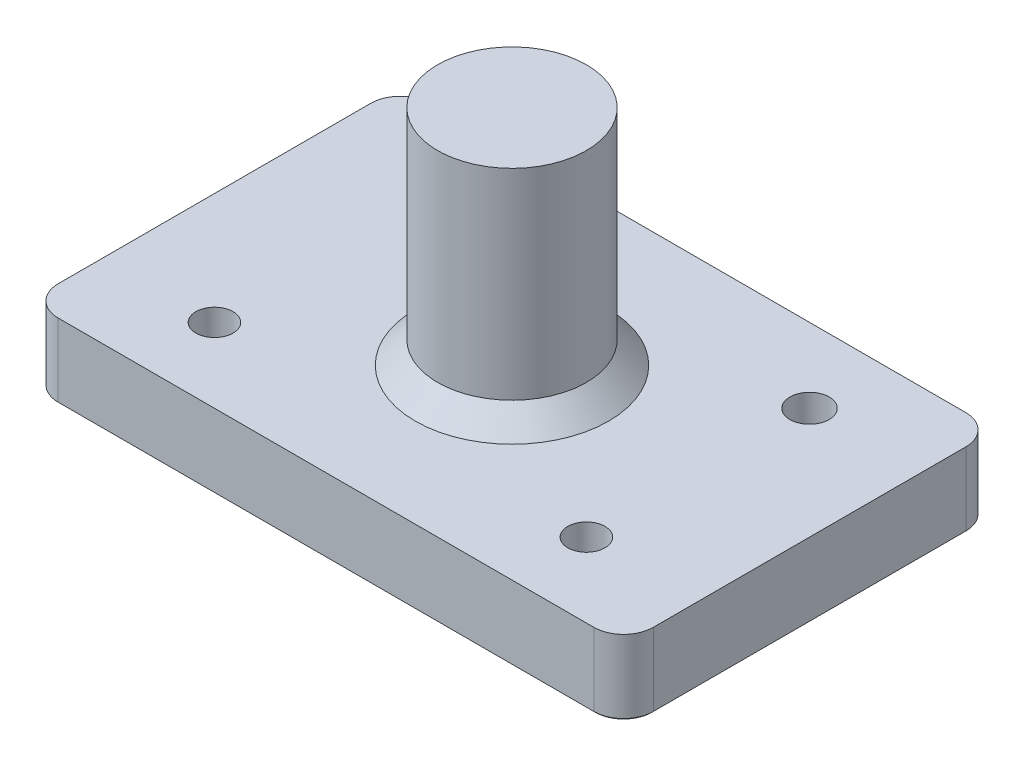
ISO-10303-21;
HEADER;
FILE_DESCRIPTION(('STEP AP214'),'2;1');
FILE_NAME('part.step','',(''),(''),'','','');
FILE_SCHEMA(('AUTOMOTIVE_DESIGN { 1 0 10303 214 1 1 1 1 }'));
ENDSEC;
DATA;
#1=APPLICATION_CONTEXT('core data for automotive mechanical design processes');
#2=APPLICATION_PROTOCOL_DEFINITION('international standard','automotive_design',2000,#1);
#3=PRODUCT_CONTEXT('',#1,'mechanical');
#4=PRODUCT('Part','Part','',(#3));
#5=PRODUCT_RELATED_PRODUCT_CATEGORY('part','',(#4));
#6=PRODUCT_DEFINITION_FORMATION('','',#4);
#7=PRODUCT_DEFINITION_CONTEXT('part definition',#1,'design');
#8=PRODUCT_DEFINITION('design','',#6,#7);
#9=PRODUCT_DEFINITION_SHAPE('','',#8);
#10=(LENGTH_UNIT() NAMED_UNIT(*) SI_UNIT(.MILLI.,.METRE.));
#11=(NAMED_UNIT(*) PLANE_ANGLE_UNIT() SI_UNIT($,.RADIAN.));
#12=(NAMED_UNIT(*) SI_UNIT($,.STERADIAN.) SOLID_ANGLE_UNIT());
#13=UNCERTAINTY_MEASURE_WITH_UNIT(LENGTH_MEASURE(1.E-05),#10,'distance_accuracy_value','');
#14=(GEOMETRIC_REPRESENTATION_CONTEXT(3) GLOBAL_UNCERTAINTY_ASSIGNED_CONTEXT((#13)) GLOBAL_UNIT_ASSIGNED_CONTEXT((#10,
#11,#12)) REPRESENTATION_CONTEXT('',''));
#15=CARTESIAN_POINT('',(0.,0.,0.));
#16=DIRECTION('',(0.,0.,1.));
#17=DIRECTION('',(1.,0.,0.));
#18=AXIS2_PLACEMENT_3D('',#15,#16,#17);
#19=CARTESIAN_POINT('',(0.,12.7,0.));
#20=DIRECTION('',(0.,-1.,0.));
#21=DIRECTION('',(0.,0.,-1.));
#22=AXIS2_PLACEMENT_3D('',#19,#20,#21);
#23=PLANE('',#22);
#24=CARTESIAN_POINT('',(0.,12.7,0.));
#25=DIRECTION('',(0.,-1.,0.));
#26=DIRECTION('',(0.,0.,-1.));
#27=AXIS2_PLACEMENT_3D('',#24,#25,#26);
#28=CIRCLE('',#27,16.5100000000001);
#29=CARTESIAN_POINT('',(0.,12.7,-16.5100000000001));
#30=VERTEX_POINT('',#29);
#31=EDGE_CURVE('E150',#30,#30,#28,.T.);
#32=ORIENTED_EDGE('',*,*,#31,.T.);
#33=EDGE_LOOP('',(#32));
#34=FACE_BOUND('',#33,.T.);
#35=DIRECTION('',(0.,0.,1.));
#36=VECTOR('',#35,1.);
#37=CARTESIAN_POINT('',(-50.8000000000001,12.7,31.75));
#38=LINE('',#37,#36);
#39=CARTESIAN_POINT('',(-50.8000000000001,12.7,-26.6700000000001));
#40=VERTEX_POINT('',#39);
#41=CARTESIAN_POINT('',(-50.8000000000001,12.7,26.67));
#42=VERTEX_POINT('',#41);
#43=EDGE_CURVE('E133',#40,#42,#38,.T.);
#44=ORIENTED_EDGE('',*,*,#43,.T.);
#45=CARTESIAN_POINT('',(-45.7200000000001,12.7,26.67));
#46=DIRECTION('',(0.,-1.,0.));
#47=DIRECTION('',(0.,0.,-1.));
#48=AXIS2_PLACEMENT_3D('',#45,#46,#47);
#49=CIRCLE('',#48,5.08);
#50=CARTESIAN_POINT('',(-45.7200000000001,12.7,31.75));
#51=VERTEX_POINT('',#50);
#52=EDGE_CURVE('E127',#42,#51,#49,.F.);
#53=ORIENTED_EDGE('',*,*,#52,.T.);
#54=DIRECTION('',(1.,0.,0.));
#55=VECTOR('',#54,1.);
#56=CARTESIAN_POINT('',(-50.8000000000001,12.7,31.75));
#57=LINE('',#56,#55);
#58=CARTESIAN_POINT('',(45.72,12.7,31.75));
#59=VERTEX_POINT('',#58);
#60=EDGE_CURVE('E130',#51,#59,#57,.T.);
#61=ORIENTED_EDGE('',*,*,#60,.T.);
#62=CARTESIAN_POINT('',(45.7200000000001,12.7,26.6700000000001));
#63=DIRECTION('',(0.,-1.,0.));
#64=DIRECTION('',(0.,0.,-1.));
#65=AXIS2_PLACEMENT_3D('',#62,#63,#64);
#66=CIRCLE('',#65,5.08);
#67=CARTESIAN_POINT('',(50.8000000000001,12.7,26.6700000000001));
#68=VERTEX_POINT('',#67);
#69=EDGE_CURVE('E135',#59,#68,#66,.F.);
#70=ORIENTED_EDGE('',*,*,#69,.T.);
#71=DIRECTION('',(0.,0.,-1.));
#72=VECTOR('',#71,1.);
#73=CARTESIAN_POINT('',(50.8000000000001,12.7,31.75));
#74=LINE('',#73,#72);
#75=CARTESIAN_POINT('',(50.8,12.7,-26.67));
#76=VERTEX_POINT('',#75);
#77=EDGE_CURVE('E264',#68,#76,#74,.T.);
#78=ORIENTED_EDGE('',*,*,#77,.T.);
#79=CARTESIAN_POINT('',(45.72,12.7,-26.67));
#80=DIRECTION('',(0.,-1.,0.));
#81=DIRECTION('',(0.,0.,-1.));
#82=AXIS2_PLACEMENT_3D('',#79,#80,#81);
#83=CIRCLE('',#82,5.08);
#84=CARTESIAN_POINT('',(45.72,12.7,-31.75));
#85=VERTEX_POINT('',#84);
#86=EDGE_CURVE('E157',#76,#85,#83,.F.);
#87=ORIENTED_EDGE('',*,*,#86,.T.);
#88=DIRECTION('',(-1.,0.,0.));
#89=VECTOR('',#88,1.);
#90=CARTESIAN_POINT('',(-50.8000000000001,12.7,-31.7500000000001));
#91=LINE('',#90,#89);
#92=CARTESIAN_POINT('',(-45.7200000000001,12.7,-31.7500000000001));
#93=VERTEX_POINT('',#92);
#94=EDGE_CURVE('E267',#85,#93,#91,.T.);
#95=ORIENTED_EDGE('',*,*,#94,.T.);
#96=CARTESIAN_POINT('',(-45.7200000000001,12.7,-26.6700000000001));
#97=DIRECTION('',(0.,-1.,0.));
#98=DIRECTION('',(0.,0.,-1.));
#99=AXIS2_PLACEMENT_3D('',#96,#97,#98);
#100=CIRCLE('',#99,5.08);
#101=EDGE_CURVE('E155',#93,#40,#100,.F.);
#102=ORIENTED_EDGE('',*,*,#101,.T.);
#103=EDGE_LOOP('',(#44,#53,#61,#70,#78,#87,#95,#102));
#104=FACE_BOUND('',#103,.T.);
#105=CARTESIAN_POINT('',(-31.75,12.7,19.05));
#106=DIRECTION('',(0.,1.,0.));
#107=DIRECTION('',(0.,0.,1.));
#108=AXIS2_PLACEMENT_3D('',#105,#106,#107);
#109=CIRCLE('',#108,3.175);
#110=CARTESIAN_POINT('',(-31.75,12.7,22.225));
#111=VERTEX_POINT('',#110);
#112=EDGE_CURVE('E261',#111,#111,#109,.T.);
#113=ORIENTED_EDGE('',*,*,#112,.F.);
#114=EDGE_LOOP('',(#113));
#115=FACE_BOUND('',#114,.T.);
#116=CARTESIAN_POINT('',(-31.75,12.7,-19.05));
#117=DIRECTION('',(0.,1.,0.));
#118=DIRECTION('',(0.,0.,1.));
#119=AXIS2_PLACEMENT_3D('',#116,#117,#118);
#120=CIRCLE('',#119,3.175);
#121=CARTESIAN_POINT('',(-31.75,12.7,-15.875));
#122=VERTEX_POINT('',#121);
#123=EDGE_CURVE('E258',#122,#122,#120,.T.);
#124=ORIENTED_EDGE('',*,*,#123,.F.);
#125=EDGE_LOOP('',(#124));
#126=FACE_BOUND('',#125,.T.);
#127=CARTESIAN_POINT('',(31.7500000000001,12.7,19.05));
#128=DIRECTION('',(0.,1.,0.));
#129=DIRECTION('',(0.,0.,1.));
#130=AXIS2_PLACEMENT_3D('',#127,#128,#129);
#131=CIRCLE('',#130,3.175);
#132=CARTESIAN_POINT('',(31.7500000000001,12.7,22.225));
#133=VERTEX_POINT('',#132);
#134=EDGE_CURVE('E253',#133,#133,#131,.T.);
#135=ORIENTED_EDGE('',*,*,#134,.F.);
#136=EDGE_LOOP('',(#135));
#137=FACE_BOUND('',#136,.T.);
#138=CARTESIAN_POINT('',(31.75,12.7,-19.0500000000001));
#139=DIRECTION('',(0.,1.,0.));
#140=DIRECTION('',(0.,0.,1.));
#141=AXIS2_PLACEMENT_3D('',#138,#139,#140);
#142=CIRCLE('',#141,3.34923459708312);
#143=CARTESIAN_POINT('',(31.75,12.7,-15.7007654029169));
#144=VERTEX_POINT('',#143);
#145=EDGE_CURVE('E248',#144,#144,#142,.T.);
#146=ORIENTED_EDGE('',*,*,#145,.F.);
#147=EDGE_LOOP('',(#146));
#148=FACE_BOUND('',#147,.T.);
#149=ADVANCED_FACE('F33',(#34,#104,#115,#126,#137,#148),#23,.F.);
#150=CARTESIAN_POINT('',(0.,0.,0.));
#151=DIRECTION('',(0.,-1.,0.));
#152=DIRECTION('',(0.,0.,-1.));
#153=AXIS2_PLACEMENT_3D('',#150,#151,#152);
#154=PLANE('',#153);
#155=CARTESIAN_POINT('',(31.75,0.,-19.0500000000001));
#156=DIRECTION('',(0.,-1.,0.));
#157=DIRECTION('',(0.,0.,-1.));
#158=AXIS2_PLACEMENT_3D('',#155,#156,#157);
#159=CIRCLE('',#158,3.6032345970831);
#160=CARTESIAN_POINT('',(31.75,0.,-22.6532345970832));
#161=VERTEX_POINT('',#160);
#162=EDGE_CURVE('E195',#161,#161,#159,.F.);
#163=ORIENTED_EDGE('',*,*,#162,.T.);
#164=EDGE_LOOP('',(#163));
#165=FACE_BOUND('',#164,.T.);
#166=CARTESIAN_POINT('',(-31.7500000000001,0.,-19.05));
#167=DIRECTION('',(0.,-1.,0.));
#168=DIRECTION('',(0.,0.,-1.));
#169=AXIS2_PLACEMENT_3D('',#166,#167,#168);
#170=CIRCLE('',#169,3.429);
#171=CARTESIAN_POINT('',(-31.7500000000001,0.,-22.4790000000001));
#172=VERTEX_POINT('',#171);
#173=EDGE_CURVE('E192',#172,#172,#170,.F.);
#174=ORIENTED_EDGE('',*,*,#173,.T.);
#175=EDGE_LOOP('',(#174));
#176=FACE_BOUND('',#175,.T.);
#177=DIRECTION('',(0.,0.,1.));
#178=VECTOR('',#177,1.);
#179=CARTESIAN_POINT('',(50.546,0.,26.67));
#180=LINE('',#179,#178);
#181=CARTESIAN_POINT('',(50.546,0.,-26.67));
#182=VERTEX_POINT('',#181);
#183=CARTESIAN_POINT('',(50.546,0.,26.67));
#184=VERTEX_POINT('',#183);
#185=EDGE_CURVE('E187',#182,#184,#180,.T.);
#186=ORIENTED_EDGE('',*,*,#185,.T.);
#187=CARTESIAN_POINT('',(45.7200000000001,0.,26.6700000000001));
#188=DIRECTION('',(0.,-1.,0.));
#189=DIRECTION('',(0.,0.,-1.));
#190=AXIS2_PLACEMENT_3D('',#187,#188,#189);
#191=CIRCLE('',#190,4.826);
#192=CARTESIAN_POINT('',(45.7200000000001,0.,31.496));
#193=VERTEX_POINT('',#192);
#194=EDGE_CURVE('E189',#184,#193,#191,.T.);
#195=ORIENTED_EDGE('',*,*,#194,.T.);
#196=DIRECTION('',(-1.,0.,0.));
#197=VECTOR('',#196,1.);
#198=CARTESIAN_POINT('',(-45.7200000000001,0.,31.496));
#199=LINE('',#198,#197);
#200=CARTESIAN_POINT('',(-45.7200000000001,0.,31.496));
#201=VERTEX_POINT('',#200);
#202=EDGE_CURVE('E175',#193,#201,#199,.T.);
#203=ORIENTED_EDGE('',*,*,#202,.T.);
#204=CARTESIAN_POINT('',(-45.7200000000001,0.,26.67));
#205=DIRECTION('',(0.,-1.,0.));
#206=DIRECTION('',(0.,0.,-1.));
#207=AXIS2_PLACEMENT_3D('',#204,#205,#206);
#208=CIRCLE('',#207,4.826);
#209=CARTESIAN_POINT('',(-50.5460000000001,0.,26.67));
#210=VERTEX_POINT('',#209);
#211=EDGE_CURVE('E177',#201,#210,#208,.T.);
#212=ORIENTED_EDGE('',*,*,#211,.T.);
#213=DIRECTION('',(0.,0.,-1.));
#214=VECTOR('',#213,1.);
#215=CARTESIAN_POINT('',(-50.5460000000001,0.,-26.6700000000001));
#216=LINE('',#215,#214);
#217=CARTESIAN_POINT('',(-50.5460000000001,0.,-26.6700000000001));
#218=VERTEX_POINT('',#217);
#219=EDGE_CURVE('E179',#210,#218,#216,.T.);
#220=ORIENTED_EDGE('',*,*,#219,.T.);
#221=CARTESIAN_POINT('',(-45.7200000000001,0.,-26.6700000000001));
#222=DIRECTION('',(0.,-1.,0.));
#223=DIRECTION('',(0.,0.,-1.));
#224=AXIS2_PLACEMENT_3D('',#221,#222,#223);
#225=CIRCLE('',#224,4.826);
#226=CARTESIAN_POINT('',(-45.7200000000001,0.,-31.496));
#227=VERTEX_POINT('',#226);
#228=EDGE_CURVE('E181',#218,#227,#225,.T.);
#229=ORIENTED_EDGE('',*,*,#228,.T.);
#230=DIRECTION('',(1.,0.,0.));
#231=VECTOR('',#230,1.);
#232=CARTESIAN_POINT('',(45.72,0.,-31.496));
#233=LINE('',#232,#231);
#234=CARTESIAN_POINT('',(45.72,0.,-31.496));
#235=VERTEX_POINT('',#234);
#236=EDGE_CURVE('E183',#227,#235,#233,.T.);
#237=ORIENTED_EDGE('',*,*,#236,.T.);
#238=CARTESIAN_POINT('',(45.72,0.,-26.67));
#239=DIRECTION('',(0.,-1.,0.));
#240=DIRECTION('',(0.,0.,-1.));
#241=AXIS2_PLACEMENT_3D('',#238,#239,#240);
#242=CIRCLE('',#241,4.826);
#243=EDGE_CURVE('E185',#235,#182,#242,.T.);
#244=ORIENTED_EDGE('',*,*,#243,.T.);
#245=EDGE_LOOP('',(#186,#195,#203,#212,#220,#229,#237,#244));
#246=FACE_BOUND('',#245,.T.);
#247=CARTESIAN_POINT('',(-31.75,0.,19.05));
#248=DIRECTION('',(0.,-1.,0.));
#249=DIRECTION('',(0.,0.,-1.));
#250=AXIS2_PLACEMENT_3D('',#247,#248,#249);
#251=CIRCLE('',#250,3.429);
#252=CARTESIAN_POINT('',(-31.75,0.,15.621));
#253=VERTEX_POINT('',#252);
#254=EDGE_CURVE('E172',#253,#253,#251,.F.);
#255=ORIENTED_EDGE('',*,*,#254,.T.);
#256=EDGE_LOOP('',(#255));
#257=FACE_BOUND('',#256,.T.);
#258=CARTESIAN_POINT('',(31.75,0.,19.05));
#259=DIRECTION('',(0.,-1.,0.));
#260=DIRECTION('',(0.,0.,-1.));
#261=AXIS2_PLACEMENT_3D('',#258,#259,#260);
#262=CIRCLE('',#261,3.429);
#263=CARTESIAN_POINT('',(31.75,0.,15.621));
#264=VERTEX_POINT('',#263);
#265=EDGE_CURVE('E169',#264,#264,#262,.F.);
#266=ORIENTED_EDGE('',*,*,#265,.T.);
#267=EDGE_LOOP('',(#266));
#268=FACE_BOUND('',#267,.T.);
#269=ADVANCED_FACE('F297',(#165,#176,#246,#257,#268),#154,.T.);
#270=CARTESIAN_POINT('',(50.8000000000001,12.7,31.75));
#271=DIRECTION('',(-1.,0.,0.));
#272=DIRECTION('',(0.,0.,1.));
#273=AXIS2_PLACEMENT_3D('',#270,#271,#272);
#274=PLANE('',#273);
#275=DIRECTION('',(0.,-1.,0.));
#276=VECTOR('',#275,1.);
#277=CARTESIAN_POINT('',(50.8000000000001,12.7,26.6700000000001));
#278=LINE('',#277,#276);
#279=CARTESIAN_POINT('',(50.8000000000001,0.254000000000004,26.6700000000001));
#280=VERTEX_POINT('',#279);
#281=EDGE_CURVE('E161',#68,#280,#278,.T.);
#282=ORIENTED_EDGE('',*,*,#281,.T.);
#283=DIRECTION('',(0.,0.,-1.));
#284=VECTOR('',#283,1.);
#285=CARTESIAN_POINT('',(50.8,0.254000000000004,-26.67));
#286=LINE('',#285,#284);
#287=CARTESIAN_POINT('',(50.8,0.254000000000004,-26.67));
#288=VERTEX_POINT('',#287);
#289=EDGE_CURVE('E207',#280,#288,#286,.T.);
#290=ORIENTED_EDGE('',*,*,#289,.T.);
#291=DIRECTION('',(0.,-1.,0.));
#292=VECTOR('',#291,1.);
#293=CARTESIAN_POINT('',(50.8,12.7,-26.67));
#294=LINE('',#293,#292);
#295=EDGE_CURVE('E134',#288,#76,#294,.F.);
#296=ORIENTED_EDGE('',*,*,#295,.T.);
#297=ORIENTED_EDGE('',*,*,#77,.F.);
#298=EDGE_LOOP('',(#282,#290,#296,#297));
#299=FACE_BOUND('',#298,.T.);
#300=ADVANCED_FACE('F302',(#299),#274,.F.);
#301=CARTESIAN_POINT('',(-50.8000000000001,12.7,-31.7500000000001));
#302=DIRECTION('',(0.,0.,1.));
#303=DIRECTION('',(1.,0.,0.));
#304=AXIS2_PLACEMENT_3D('',#301,#302,#303);
#305=PLANE('',#304);
#306=DIRECTION('',(0.,-1.,0.));
#307=VECTOR('',#306,1.);
#308=CARTESIAN_POINT('',(45.72,12.7,-31.75));
#309=LINE('',#308,#307);
#310=CARTESIAN_POINT('',(45.72,0.254000000000004,-31.75));
#311=VERTEX_POINT('',#310);
#312=EDGE_CURVE('E166',#85,#311,#309,.T.);
#313=ORIENTED_EDGE('',*,*,#312,.T.);
#314=DIRECTION('',(-1.,0.,0.));
#315=VECTOR('',#314,1.);
#316=CARTESIAN_POINT('',(-45.7200000000001,0.253999999999949,-31.7500000000001));
#317=LINE('',#316,#315);
#318=CARTESIAN_POINT('',(-45.7200000000001,0.253999999999949,-31.7500000000001));
#319=VERTEX_POINT('',#318);
#320=EDGE_CURVE('E211',#311,#319,#317,.T.);
#321=ORIENTED_EDGE('',*,*,#320,.T.);
#322=DIRECTION('',(0.,-1.,0.));
#323=VECTOR('',#322,1.);
#324=CARTESIAN_POINT('',(-45.7200000000001,12.7,-31.7500000000001));
#325=LINE('',#324,#323);
#326=EDGE_CURVE('E164',#319,#93,#325,.F.);
#327=ORIENTED_EDGE('',*,*,#326,.T.);
#328=ORIENTED_EDGE('',*,*,#94,.F.);
#329=EDGE_LOOP('',(#313,#321,#327,#328));
#330=FACE_BOUND('',#329,.T.);
#331=ADVANCED_FACE('F314',(#330),#305,.F.);
#332=CARTESIAN_POINT('',(-50.8000000000001,12.7,31.75));
#333=DIRECTION('',(1.,0.,0.));
#334=DIRECTION('',(0.,0.,-1.));
#335=AXIS2_PLACEMENT_3D('',#332,#333,#334);
#336=PLANE('',#335);
#337=DIRECTION('',(0.,-1.,0.));
#338=VECTOR('',#337,1.);
#339=CARTESIAN_POINT('',(-50.8000000000001,12.7,-26.6700000000001));
#340=LINE('',#339,#338);
#341=CARTESIAN_POINT('',(-50.8000000000001,0.253999999999949,-26.67));
#342=VERTEX_POINT('',#341);
#343=EDGE_CURVE('E146',#40,#342,#340,.T.);
#344=ORIENTED_EDGE('',*,*,#343,.T.);
#345=DIRECTION('',(0.,0.,1.));
#346=VECTOR('',#345,1.);
#347=CARTESIAN_POINT('',(-50.8000000000001,0.254000000000004,26.67));
#348=LINE('',#347,#346);
#349=CARTESIAN_POINT('',(-50.8000000000001,0.254000000000004,26.67));
#350=VERTEX_POINT('',#349);
#351=EDGE_CURVE('E58',#342,#350,#348,.T.);
#352=ORIENTED_EDGE('',*,*,#351,.T.);
#353=DIRECTION('',(0.,-1.,0.));
#354=VECTOR('',#353,1.);
#355=CARTESIAN_POINT('',(-50.8000000000001,12.7,26.67));
#356=LINE('',#355,#354);
#357=EDGE_CURVE('E148',#350,#42,#356,.F.);
#358=ORIENTED_EDGE('',*,*,#357,.T.);
#359=ORIENTED_EDGE('',*,*,#43,.F.);
#360=EDGE_LOOP('',(#344,#352,#358,#359));
#361=FACE_BOUND('',#360,.T.);
#362=ADVANCED_FACE('F311',(#361),#336,.F.);
#363=CARTESIAN_POINT('',(-50.8000000000001,12.7,31.75));
#364=DIRECTION('',(0.,0.,-1.));
#365=DIRECTION('',(-1.,0.,0.));
#366=AXIS2_PLACEMENT_3D('',#363,#364,#365);
#367=PLANE('',#366);
#368=DIRECTION('',(0.,-1.,0.));
#369=VECTOR('',#368,1.);
#370=CARTESIAN_POINT('',(-45.7200000000001,12.7,31.75));
#371=LINE('',#370,#369);
#372=CARTESIAN_POINT('',(-45.7200000000001,0.254000000000004,31.75));
#373=VERTEX_POINT('',#372);
#374=EDGE_CURVE('E139',#51,#373,#371,.T.);
#375=ORIENTED_EDGE('',*,*,#374,.T.);
#376=DIRECTION('',(1.,0.,0.));
#377=VECTOR('',#376,1.);
#378=CARTESIAN_POINT('',(45.72,0.254000000000004,31.75));
#379=LINE('',#378,#377);
#380=CARTESIAN_POINT('',(45.72,0.254000000000004,31.75));
#381=VERTEX_POINT('',#380);
#382=EDGE_CURVE('E217',#373,#381,#379,.T.);
#383=ORIENTED_EDGE('',*,*,#382,.T.);
#384=DIRECTION('',(0.,-1.,0.));
#385=VECTOR('',#384,1.);
#386=CARTESIAN_POINT('',(45.72,12.7,31.75));
#387=LINE('',#386,#385);
#388=EDGE_CURVE('E142',#381,#59,#387,.F.);
#389=ORIENTED_EDGE('',*,*,#388,.T.);
#390=ORIENTED_EDGE('',*,*,#60,.F.);
#391=EDGE_LOOP('',(#375,#383,#389,#390));
#392=FACE_BOUND('',#391,.T.);
#393=ADVANCED_FACE('F138',(#392),#367,.F.);
#394=CARTESIAN_POINT('',(-31.75,12.7,19.05));
#395=DIRECTION('',(0.,-1.,0.));
#396=DIRECTION('',(0.,0.,-1.));
#397=AXIS2_PLACEMENT_3D('',#394,#395,#396);
#398=CYLINDRICAL_SURFACE('',#397,3.175);
#399=CARTESIAN_POINT('',(-31.75,0.254000000000046,19.05));
#400=DIRECTION('',(0.,-1.,0.));
#401=DIRECTION('',(0.,0.,-1.));
#402=AXIS2_PLACEMENT_3D('',#399,#400,#401);
#403=CIRCLE('',#402,3.175);
#404=CARTESIAN_POINT('',(-31.75,0.254000000000046,15.875));
#405=VERTEX_POINT('',#404);
#406=EDGE_CURVE('E42',#405,#405,#403,.T.);
#407=ORIENTED_EDGE('',*,*,#406,.T.);
#408=EDGE_LOOP('',(#407));
#409=FACE_BOUND('',#408,.T.);
#410=ORIENTED_EDGE('',*,*,#112,.T.);
#411=EDGE_LOOP('',(#410));
#412=FACE_BOUND('',#411,.T.);
#413=ADVANCED_FACE('F306',(#409,#412),#398,.F.);
#414=CARTESIAN_POINT('',(-31.75,12.7,-19.05));
#415=DIRECTION('',(0.,-1.,0.));
#416=DIRECTION('',(0.,0.,-1.));
#417=AXIS2_PLACEMENT_3D('',#414,#415,#416);
#418=CYLINDRICAL_SURFACE('',#417,3.175);
#419=CARTESIAN_POINT('',(-31.7500000000001,0.25399999999999,-19.05));
#420=DIRECTION('',(0.,-1.,0.));
#421=DIRECTION('',(0.,0.,-1.));
#422=AXIS2_PLACEMENT_3D('',#419,#420,#421);
#423=CIRCLE('',#422,3.175);
#424=CARTESIAN_POINT('',(-31.7500000000001,0.25399999999999,-22.225));
#425=VERTEX_POINT('',#424);
#426=EDGE_CURVE('E201',#425,#425,#423,.T.);
#427=ORIENTED_EDGE('',*,*,#426,.T.);
#428=EDGE_LOOP('',(#427));
#429=FACE_BOUND('',#428,.T.);
#430=ORIENTED_EDGE('',*,*,#123,.T.);
#431=EDGE_LOOP('',(#430));
#432=FACE_BOUND('',#431,.T.);
#433=ADVANCED_FACE('F389',(#429,#432),#418,.F.);
#434=CARTESIAN_POINT('',(31.7500000000001,12.7,19.05));
#435=DIRECTION('',(0.,-1.,0.));
#436=DIRECTION('',(0.,0.,-1.));
#437=AXIS2_PLACEMENT_3D('',#434,#435,#436);
#438=CYLINDRICAL_SURFACE('',#437,3.175);
#439=CARTESIAN_POINT('',(31.75,0.253999999999949,19.05));
#440=DIRECTION('',(0.,-1.,0.));
#441=DIRECTION('',(0.,0.,-1.));
#442=AXIS2_PLACEMENT_3D('',#439,#440,#441);
#443=CIRCLE('',#442,3.175);
#444=CARTESIAN_POINT('',(31.75,0.253999999999949,15.875));
#445=VERTEX_POINT('',#444);
#446=EDGE_CURVE('E11',#445,#445,#443,.T.);
#447=ORIENTED_EDGE('',*,*,#446,.T.);
#448=EDGE_LOOP('',(#447));
#449=FACE_BOUND('',#448,.T.);
#450=ORIENTED_EDGE('',*,*,#134,.T.);
#451=EDGE_LOOP('',(#450));
#452=FACE_BOUND('',#451,.T.);
#453=ADVANCED_FACE('F293',(#449,#452),#438,.F.);
#454=CARTESIAN_POINT('',(31.75,12.7,-19.0500000000001));
#455=DIRECTION('',(0.,-1.,0.));
#456=DIRECTION('',(0.,0.,-1.));
#457=AXIS2_PLACEMENT_3D('',#454,#455,#456);
#458=CYLINDRICAL_SURFACE('',#457,3.34923459708312);
#459=CARTESIAN_POINT('',(31.75,0.253999999999935,-19.0500000000001));
#460=DIRECTION('',(0.,-1.,0.));
#461=DIRECTION('',(0.,0.,-1.));
#462=AXIS2_PLACEMENT_3D('',#459,#460,#461);
#463=CIRCLE('',#462,3.34923459708312);
#464=CARTESIAN_POINT('',(31.75,0.253999999999935,-22.3992345970832));
#465=VERTEX_POINT('',#464);
#466=EDGE_CURVE('E198',#465,#465,#463,.T.);
#467=ORIENTED_EDGE('',*,*,#466,.T.);
#468=EDGE_LOOP('',(#467));
#469=FACE_BOUND('',#468,.T.);
#470=ORIENTED_EDGE('',*,*,#145,.T.);
#471=EDGE_LOOP('',(#470));
#472=FACE_BOUND('',#471,.T.);
#473=ADVANCED_FACE('F286',(#469,#472),#458,.F.);
#474=CARTESIAN_POINT('',(0.,50.8,0.));
#475=DIRECTION('',(0.,-1.,0.));
#476=DIRECTION('',(0.,0.,-1.));
#477=AXIS2_PLACEMENT_3D('',#474,#475,#476);
#478=CYLINDRICAL_SURFACE('',#477,12.7);
#479=CARTESIAN_POINT('',(0.,16.5100000000001,0.));
#480=DIRECTION('',(0.,-1.,0.));
#481=DIRECTION('',(0.,0.,-1.));
#482=AXIS2_PLACEMENT_3D('',#479,#480,#481);
#483=CIRCLE('',#482,12.7);
#484=CARTESIAN_POINT('',(0.,16.5100000000001,-12.7));
#485=VERTEX_POINT('',#484);
#486=EDGE_CURVE('E143',#485,#485,#483,.F.);
#487=CARTESIAN_POINT('',(0.,50.8,0.));
#488=DIRECTION('',(0.,1.,0.));
#489=DIRECTION('',(0.,0.,1.));
#490=AXIS2_PLACEMENT_3D('',#487,#488,#489);
#491=CIRCLE('',#490,12.7);
#492=CARTESIAN_POINT('',(0.,50.8,-12.7));
#493=VERTEX_POINT('',#492);
#494=EDGE_CURVE('E242',#493,#493,#491,.T.);
#495=CARTESIAN_POINT('',(0.,16.5100000000001,-12.7));
#496=CARTESIAN_POINT('',(0.,16.8671875000001,-12.7));
#497=CARTESIAN_POINT('',(0.,17.2243750000001,-12.7));
#498=CARTESIAN_POINT('',(0.,17.9387500000001,-12.7));
#499=CARTESIAN_POINT('',(0.,18.2959375000001,-12.7));
#500=CARTESIAN_POINT('',(0.,19.0103125000001,-12.7));
#501=CARTESIAN_POINT('',(0.,19.3675000000001,-12.7));
#502=CARTESIAN_POINT('',(0.,20.0818750000001,-12.7));
#503=CARTESIAN_POINT('',(0.,20.4390625000001,-12.7));
#504=CARTESIAN_POINT('',(0.,21.1534375000001,-12.7));
#505=CARTESIAN_POINT('',(0.,21.5106250000001,-12.7));
#506=CARTESIAN_POINT('',(0.,22.2250000000001,-12.7));
#507=CARTESIAN_POINT('',(0.,22.5821875000001,-12.7));
#508=CARTESIAN_POINT('',(0.,23.2965625000001,-12.7));
#509=CARTESIAN_POINT('',(0.,23.6537500000001,-12.7));
#510=CARTESIAN_POINT('',(0.,24.3681250000001,-12.7));
#511=CARTESIAN_POINT('',(0.,24.7253125000001,-12.7));
#512=CARTESIAN_POINT('',(0.,25.4396875000001,-12.7));
#513=CARTESIAN_POINT('',(0.,25.7968750000001,-12.7));
#514=CARTESIAN_POINT('',(0.,26.5112500000001,-12.7));
#515=CARTESIAN_POINT('',(0.,26.8684375000001,-12.7));
#516=CARTESIAN_POINT('',(0.,27.5828125000001,-12.7));
#517=CARTESIAN_POINT('',(0.,27.9400000000001,-12.7));
#518=CARTESIAN_POINT('',(0.,28.6543750000001,-12.7));
#519=CARTESIAN_POINT('',(0.,29.0115625000001,-12.7));
#520=CARTESIAN_POINT('',(0.,29.7259375000001,-12.7));
#521=CARTESIAN_POINT('',(0.,30.0831250000001,-12.7));
#522=CARTESIAN_POINT('',(0.,30.7975000000001,-12.7));
#523=CARTESIAN_POINT('',(0.,31.1546875000001,-12.7));
#524=CARTESIAN_POINT('',(0.,31.8690625000001,-12.7));
#525=CARTESIAN_POINT('',(0.,32.2262500000001,-12.7));
#526=CARTESIAN_POINT('',(0.,32.9406250000001,-12.7));
#527=CARTESIAN_POINT('',(0.,33.2978125,-12.7));
#528=CARTESIAN_POINT('',(0.,34.0121875000001,-12.7));
#529=CARTESIAN_POINT('',(0.,34.369375,-12.7));
#530=CARTESIAN_POINT('',(0.,35.08375,-12.7));
#531=CARTESIAN_POINT('',(0.,35.4409375,-12.7));
#532=CARTESIAN_POINT('',(0.,36.1553125,-12.7));
#533=CARTESIAN_POINT('',(0.,36.5125,-12.7));
#534=CARTESIAN_POINT('',(0.,37.226875,-12.7));
#535=CARTESIAN_POINT('',(0.,37.5840625,-12.7));
#536=CARTESIAN_POINT('',(0.,38.2984375,-12.7));
#537=CARTESIAN_POINT('',(0.,38.655625,-12.7));
#538=CARTESIAN_POINT('',(0.,39.37,-12.7));
#539=CARTESIAN_POINT('',(0.,39.7271875,-12.7));
#540=CARTESIAN_POINT('',(0.,40.4415625,-12.7));
#541=CARTESIAN_POINT('',(0.,40.79875,-12.7));
#542=CARTESIAN_POINT('',(0.,41.513125,-12.7));
#543=CARTESIAN_POINT('',(0.,41.8703125,-12.7));
#544=CARTESIAN_POINT('',(0.,42.5846875,-12.7));
#545=CARTESIAN_POINT('',(0.,42.941875,-12.7));
#546=CARTESIAN_POINT('',(0.,43.65625,-12.7));
#547=CARTESIAN_POINT('',(0.,44.0134375,-12.7));
#548=CARTESIAN_POINT('',(0.,44.7278125,-12.7));
#549=CARTESIAN_POINT('',(0.,45.085,-12.7));
#550=CARTESIAN_POINT('',(0.,45.799375,-12.7));
#551=CARTESIAN_POINT('',(0.,46.1565625,-12.7));
#552=CARTESIAN_POINT('',(0.,46.8709375,-12.7));
#553=CARTESIAN_POINT('',(0.,47.228125,-12.7));
#554=CARTESIAN_POINT('',(0.,47.9425,-12.7));
#555=CARTESIAN_POINT('',(0.,48.2996875,-12.7));
#556=CARTESIAN_POINT('',(0.,49.0140625,-12.7));
#557=CARTESIAN_POINT('',(0.,49.37125,-12.7));
#558=CARTESIAN_POINT('',(0.,50.085625,-12.7));
#559=CARTESIAN_POINT('',(0.,50.4428125,-12.7));
#560=CARTESIAN_POINT('',(0.,50.8,-12.7));
#561=B_SPLINE_CURVE_WITH_KNOTS('',3,(#495,#496,#497,#498,#499,#500,#501,#502,#503,#504,#505,
#506,#507,#508,#509,#510,#511,#512,#513,#514,#515,#516,#517,#518,#519,#520,#521,#522,#523,#524,
#525,#526,#527,#528,#529,#530,#531,#532,#533,#534,#535,#536,#537,#538,#539,#540,#541,#542,#543,
#544,#545,#546,#547,#548,#549,#550,#551,#552,#553,#554,#555,#556,#557,#558,#559,#560),
.UNSPECIFIED.,.F.,.F.,(4,2,2,2,2,2,2,2,2,2,2,2,2,2,2,2,2,2,2,2,2,2,2,2,2,2,2,2,2,2,2,2,4),(0.,
1.0715625,2.143125,3.21468749999999,4.28624999999998,5.35781249999998,6.42937499999998,
7.50093749999997,8.57249999999997,9.64406249999996,10.715625,11.7871875,12.85875,
13.9303124999999,15.0018749999999,16.0734374999999,17.1449999999999,18.2165624999999,
19.2881249999999,20.3596874999999,21.4312499999999,22.5028124999999,23.5743749999999,
24.6459374999999,25.7174999999999,26.7890624999999,27.8606249999999,28.9321874999999,
30.0037499999999,31.0753124999999,32.1468749999999,33.2184374999999,34.2899999999999),.UNSPECIFIED.);
#562=EDGE_CURVE('BSEAM283',#485,#493,#561,.T.);
#563=ORIENTED_EDGE('',*,*,#486,.T.);
#564=ORIENTED_EDGE('',*,*,#494,.F.);
#565=ORIENTED_EDGE('',*,*,#562,.T.);
#566=ORIENTED_EDGE('',*,*,#562,.F.);
#567=EDGE_LOOP('',(#563,#565,#564,#566));
#568=FACE_BOUND('',#567,.T.);
#569=ADVANCED_FACE('F283',(#568),#478,.T.);
#570=CARTESIAN_POINT('',(0.,50.8,0.));
#571=DIRECTION('',(0.,1.,0.));
#572=DIRECTION('',(0.,0.,1.));
#573=AXIS2_PLACEMENT_3D('',#570,#571,#572);
#574=PLANE('',#573);
#575=ORIENTED_EDGE('',*,*,#494,.T.);
#576=EDGE_LOOP('',(#575));
#577=FACE_BOUND('',#576,.T.);
#578=ADVANCED_FACE('F279',(#577),#574,.T.);
#579=CARTESIAN_POINT('',(0.,16.5100000000001,0.));
#580=DIRECTION('',(0.,-1.,0.));
#581=DIRECTION('',(0.,0.,-1.));
#582=AXIS2_PLACEMENT_3D('',#579,#580,#581);
#583=CONICAL_SURFACE('',#582,12.7,0.785398163397445);
#584=ORIENTED_EDGE('',*,*,#31,.F.);
#585=EDGE_LOOP('',(#584));
#586=FACE_BOUND('',#585,.T.);
#587=ORIENTED_EDGE('',*,*,#486,.F.);
#588=EDGE_LOOP('',(#587));
#589=FACE_BOUND('',#588,.T.);
#590=ADVANCED_FACE('F276',(#586,#589),#583,.T.);
#591=CARTESIAN_POINT('',(-45.7200000000001,12.7,26.67));
#592=DIRECTION('',(0.,-1.,0.));
#593=DIRECTION('',(0.,0.,-1.));
#594=AXIS2_PLACEMENT_3D('',#591,#592,#593);
#595=CYLINDRICAL_SURFACE('',#594,5.08);
#596=ORIENTED_EDGE('',*,*,#357,.F.);
#597=CARTESIAN_POINT('',(-45.7200000000001,0.254000000000004,26.67));
#598=DIRECTION('',(0.,-1.,0.));
#599=DIRECTION('',(0.,0.,-1.));
#600=AXIS2_PLACEMENT_3D('',#597,#598,#599);
#601=CIRCLE('',#600,5.08);
#602=EDGE_CURVE('E50',#350,#373,#601,.F.);
#603=ORIENTED_EDGE('',*,*,#602,.T.);
#604=ORIENTED_EDGE('',*,*,#374,.F.);
#605=ORIENTED_EDGE('',*,*,#52,.F.);
#606=EDGE_LOOP('',(#596,#603,#604,#605));
#607=FACE_BOUND('',#606,.T.);
#608=ADVANCED_FACE('F145',(#607),#595,.T.);
#609=CARTESIAN_POINT('',(45.7200000000001,12.7,26.6700000000001));
#610=DIRECTION('',(0.,-1.,0.));
#611=DIRECTION('',(0.,0.,-1.));
#612=AXIS2_PLACEMENT_3D('',#609,#610,#611);
#613=CYLINDRICAL_SURFACE('',#612,5.08);
#614=ORIENTED_EDGE('',*,*,#388,.F.);
#615=CARTESIAN_POINT('',(45.7200000000001,0.254000000000004,26.6700000000001));
#616=DIRECTION('',(0.,-1.,0.));
#617=DIRECTION('',(0.,0.,-1.));
#618=AXIS2_PLACEMENT_3D('',#615,#616,#617);
#619=CIRCLE('',#618,5.08);
#620=EDGE_CURVE('E204',#381,#280,#619,.F.);
#621=ORIENTED_EDGE('',*,*,#620,.T.);
#622=ORIENTED_EDGE('',*,*,#281,.F.);
#623=ORIENTED_EDGE('',*,*,#69,.F.);
#624=EDGE_LOOP('',(#614,#621,#622,#623));
#625=FACE_BOUND('',#624,.T.);
#626=ADVANCED_FACE('F323',(#625),#613,.T.);
#627=CARTESIAN_POINT('',(45.72,12.7,-26.67));
#628=DIRECTION('',(0.,-1.,0.));
#629=DIRECTION('',(0.,0.,-1.));
#630=AXIS2_PLACEMENT_3D('',#627,#628,#629);
#631=CYLINDRICAL_SURFACE('',#630,5.08);
#632=ORIENTED_EDGE('',*,*,#295,.F.);
#633=CARTESIAN_POINT('',(45.72,0.254000000000004,-26.67));
#634=DIRECTION('',(0.,-1.,0.));
#635=DIRECTION('',(0.,0.,-1.));
#636=AXIS2_PLACEMENT_3D('',#633,#634,#635);
#637=CIRCLE('',#636,5.08);
#638=EDGE_CURVE('E209',#288,#311,#637,.F.);
#639=ORIENTED_EDGE('',*,*,#638,.T.);
#640=ORIENTED_EDGE('',*,*,#312,.F.);
#641=ORIENTED_EDGE('',*,*,#86,.F.);
#642=EDGE_LOOP('',(#632,#639,#640,#641));
#643=FACE_BOUND('',#642,.T.);
#644=ADVANCED_FACE('F326',(#643),#631,.T.);
#645=CARTESIAN_POINT('',(-45.7200000000001,12.7,-26.6700000000001));
#646=DIRECTION('',(0.,-1.,0.));
#647=DIRECTION('',(0.,0.,-1.));
#648=AXIS2_PLACEMENT_3D('',#645,#646,#647);
#649=CYLINDRICAL_SURFACE('',#648,5.08);
#650=ORIENTED_EDGE('',*,*,#326,.F.);
#651=CARTESIAN_POINT('',(-45.7200000000001,0.253999999999949,-26.6700000000001));
#652=DIRECTION('',(0.,-1.,0.));
#653=DIRECTION('',(0.,0.,-1.));
#654=AXIS2_PLACEMENT_3D('',#651,#652,#653);
#655=CIRCLE('',#654,5.08);
#656=EDGE_CURVE('E213',#319,#342,#655,.F.);
#657=ORIENTED_EDGE('',*,*,#656,.T.);
#658=ORIENTED_EDGE('',*,*,#343,.F.);
#659=ORIENTED_EDGE('',*,*,#101,.F.);
#660=EDGE_LOOP('',(#650,#657,#658,#659));
#661=FACE_BOUND('',#660,.T.);
#662=ADVANCED_FACE('F330',(#661),#649,.T.);
#663=CARTESIAN_POINT('',(31.75,0.,-19.0500000000001));
#664=DIRECTION('',(0.,-1.,0.));
#665=DIRECTION('',(0.,0.,-1.));
#666=AXIS2_PLACEMENT_3D('',#663,#664,#665);
#667=CONICAL_SURFACE('',#666,3.6032345970831,0.785398163397452);
#668=ORIENTED_EDGE('',*,*,#466,.F.);
#669=EDGE_LOOP('',(#668));
#670=FACE_BOUND('',#669,.T.);
#671=ORIENTED_EDGE('',*,*,#162,.F.);
#672=EDGE_LOOP('',(#671));
#673=FACE_BOUND('',#672,.T.);
#674=ADVANCED_FACE('F334',(#670,#673),#667,.F.);
#675=CARTESIAN_POINT('',(-31.7500000000001,0.,-19.05));
#676=DIRECTION('',(0.,-1.,0.));
#677=DIRECTION('',(0.,0.,-1.));
#678=AXIS2_PLACEMENT_3D('',#675,#676,#677);
#679=CONICAL_SURFACE('',#678,3.429,0.785398163397453);
#680=ORIENTED_EDGE('',*,*,#426,.F.);
#681=EDGE_LOOP('',(#680));
#682=FACE_BOUND('',#681,.T.);
#683=ORIENTED_EDGE('',*,*,#173,.F.);
#684=EDGE_LOOP('',(#683));
#685=FACE_BOUND('',#684,.T.);
#686=ADVANCED_FACE('F338',(#682,#685),#679,.F.);
#687=CARTESIAN_POINT('',(-45.7200000000001,0.,-26.6700000000001));
#688=DIRECTION('',(0.,1.,0.));
#689=DIRECTION('',(0.,0.,1.));
#690=AXIS2_PLACEMENT_3D('',#687,#688,#689);
#691=CONICAL_SURFACE('',#690,4.826,0.785398163397447);
#692=DIRECTION('',(0.707106781186549,-0.707106781186548,0.));
#693=VECTOR('',#692,1.);
#694=CARTESIAN_POINT('',(-50.8000000000001,0.253999999999949,-26.67));
#695=LINE('',#694,#693);
#696=EDGE_CURVE('E236',#342,#218,#695,.T.);
#697=ORIENTED_EDGE('',*,*,#696,.F.);
#698=ORIENTED_EDGE('',*,*,#656,.F.);
#699=DIRECTION('',(0.,0.707106781186547,-0.707106781186548));
#700=VECTOR('',#699,1.);
#701=CARTESIAN_POINT('',(-45.7200000000001,0.,-31.496));
#702=LINE('',#701,#700);
#703=EDGE_CURVE('E37',#227,#319,#702,.T.);
#704=ORIENTED_EDGE('',*,*,#703,.F.);
#705=ORIENTED_EDGE('',*,*,#228,.F.);
#706=EDGE_LOOP('',(#697,#698,#704,#705));
#707=FACE_BOUND('',#706,.T.);
#708=ADVANCED_FACE('F342',(#707),#691,.T.);
#709=CARTESIAN_POINT('',(-50.8000000000001,0.253999999999949,-31.7500000000001));
#710=DIRECTION('',(0.,-0.707106781186547,-0.707106781186548));
#711=DIRECTION('',(1.,0.,0.));
#712=AXIS2_PLACEMENT_3D('',#709,#710,#711);
#713=PLANE('',#712);
#714=ORIENTED_EDGE('',*,*,#703,.T.);
#715=ORIENTED_EDGE('',*,*,#320,.F.);
#716=DIRECTION('',(0.,0.707106781186547,-0.707106781186548));
#717=VECTOR('',#716,1.);
#718=CARTESIAN_POINT('',(45.72,0.,-31.496));
#719=LINE('',#718,#717);
#720=EDGE_CURVE('E234',#235,#311,#719,.T.);
#721=ORIENTED_EDGE('',*,*,#720,.F.);
#722=ORIENTED_EDGE('',*,*,#236,.F.);
#723=EDGE_LOOP('',(#714,#715,#721,#722));
#724=FACE_BOUND('',#723,.T.);
#725=ADVANCED_FACE('F368',(#724),#713,.T.);
#726=CARTESIAN_POINT('',(-50.8000000000001,0.254000000000004,31.75));
#727=DIRECTION('',(-0.707106781186548,-0.707106781186547,0.));
#728=DIRECTION('',(0.,0.,-1.));
#729=AXIS2_PLACEMENT_3D('',#726,#727,#728);
#730=PLANE('',#729);
#731=ORIENTED_EDGE('',*,*,#696,.T.);
#732=ORIENTED_EDGE('',*,*,#219,.F.);
#733=DIRECTION('',(0.707106781186549,-0.707106781186548,0.));
#734=VECTOR('',#733,1.);
#735=CARTESIAN_POINT('',(-50.8000000000001,0.254000000000004,26.67));
#736=LINE('',#735,#734);
#737=EDGE_CURVE('E231',#350,#210,#736,.T.);
#738=ORIENTED_EDGE('',*,*,#737,.F.);
#739=ORIENTED_EDGE('',*,*,#351,.F.);
#740=EDGE_LOOP('',(#731,#732,#738,#739));
#741=FACE_BOUND('',#740,.T.);
#742=ADVANCED_FACE('F364',(#741),#730,.T.);
#743=CARTESIAN_POINT('',(45.72,0.,-26.67));
#744=DIRECTION('',(0.,1.,0.));
#745=DIRECTION('',(0.,0.,1.));
#746=AXIS2_PLACEMENT_3D('',#743,#744,#745);
#747=CONICAL_SURFACE('',#746,4.826,0.785398163397447);
#748=ORIENTED_EDGE('',*,*,#720,.T.);
#749=ORIENTED_EDGE('',*,*,#638,.F.);
#750=DIRECTION('',(0.707106781186548,0.707106781186547,0.));
#751=VECTOR('',#750,1.);
#752=CARTESIAN_POINT('',(50.546,0.,-26.67));
#753=LINE('',#752,#751);
#754=EDGE_CURVE('E228',#182,#288,#753,.T.);
#755=ORIENTED_EDGE('',*,*,#754,.F.);
#756=ORIENTED_EDGE('',*,*,#243,.F.);
#757=EDGE_LOOP('',(#748,#749,#755,#756));
#758=FACE_BOUND('',#757,.T.);
#759=ADVANCED_FACE('F360',(#758),#747,.T.);
#760=CARTESIAN_POINT('',(-45.7200000000001,0.,26.67));
#761=DIRECTION('',(0.,1.,0.));
#762=DIRECTION('',(0.,0.,1.));
#763=AXIS2_PLACEMENT_3D('',#760,#761,#762);
#764=CONICAL_SURFACE('',#763,4.826,0.785398163397447);
#765=ORIENTED_EDGE('',*,*,#737,.T.);
#766=ORIENTED_EDGE('',*,*,#211,.F.);
#767=DIRECTION('',(0.,-0.707106781186547,-0.707106781186548));
#768=VECTOR('',#767,1.);
#769=CARTESIAN_POINT('',(-45.7200000000001,0.254000000000004,31.75));
#770=LINE('',#769,#768);
#771=EDGE_CURVE('E225',#373,#201,#770,.T.);
#772=ORIENTED_EDGE('',*,*,#771,.F.);
#773=ORIENTED_EDGE('',*,*,#602,.F.);
#774=EDGE_LOOP('',(#765,#766,#772,#773));
#775=FACE_BOUND('',#774,.T.);
#776=ADVANCED_FACE('F356',(#775),#764,.T.);
#777=CARTESIAN_POINT('',(50.8,0.254000000000004,31.75));
#778=DIRECTION('',(0.707106781186549,-0.707106781186548,0.));
#779=DIRECTION('',(0.,0.,1.));
#780=AXIS2_PLACEMENT_3D('',#777,#778,#779);
#781=PLANE('',#780);
#782=ORIENTED_EDGE('',*,*,#754,.T.);
#783=ORIENTED_EDGE('',*,*,#289,.F.);
#784=DIRECTION('',(0.707106781186548,0.707106781186547,0.));
#785=VECTOR('',#784,1.);
#786=CARTESIAN_POINT('',(50.546,0.,26.67));
#787=LINE('',#786,#785);
#788=EDGE_CURVE('E223',#184,#280,#787,.T.);
#789=ORIENTED_EDGE('',*,*,#788,.F.);
#790=ORIENTED_EDGE('',*,*,#185,.F.);
#791=EDGE_LOOP('',(#782,#783,#789,#790));
#792=FACE_BOUND('',#791,.T.);
#793=ADVANCED_FACE('F352',(#792),#781,.T.);
#794=CARTESIAN_POINT('',(-50.8000000000001,0.254000000000004,31.75));
#795=DIRECTION('',(0.,-0.707106781186547,0.707106781186548));
#796=DIRECTION('',(-1.,0.,0.));
#797=AXIS2_PLACEMENT_3D('',#794,#795,#796);
#798=PLANE('',#797);
#799=ORIENTED_EDGE('',*,*,#771,.T.);
#800=ORIENTED_EDGE('',*,*,#202,.F.);
#801=DIRECTION('',(0.,-0.707106781186547,-0.707106781186548));
#802=VECTOR('',#801,1.);
#803=CARTESIAN_POINT('',(45.72,0.254000000000004,31.75));
#804=LINE('',#803,#802);
#805=EDGE_CURVE('E221',#381,#193,#804,.T.);
#806=ORIENTED_EDGE('',*,*,#805,.F.);
#807=ORIENTED_EDGE('',*,*,#382,.F.);
#808=EDGE_LOOP('',(#799,#800,#806,#807));
#809=FACE_BOUND('',#808,.T.);
#810=ADVANCED_FACE('F348',(#809),#798,.T.);
#811=CARTESIAN_POINT('',(45.7200000000001,0.,26.6700000000001));
#812=DIRECTION('',(0.,1.,0.));
#813=DIRECTION('',(0.,0.,1.));
#814=AXIS2_PLACEMENT_3D('',#811,#812,#813);
#815=CONICAL_SURFACE('',#814,4.826,0.785398163397447);
#816=ORIENTED_EDGE('',*,*,#788,.T.);
#817=ORIENTED_EDGE('',*,*,#620,.F.);
#818=ORIENTED_EDGE('',*,*,#805,.T.);
#819=ORIENTED_EDGE('',*,*,#194,.F.);
#820=EDGE_LOOP('',(#816,#817,#818,#819));
#821=FACE_BOUND('',#820,.T.);
#822=ADVANCED_FACE('F344',(#821),#815,.T.);
#823=CARTESIAN_POINT('',(-31.75,0.,19.05));
#824=DIRECTION('',(0.,-1.,0.));
#825=DIRECTION('',(0.,0.,-1.));
#826=AXIS2_PLACEMENT_3D('',#823,#824,#825);
#827=CONICAL_SURFACE('',#826,3.429,0.785398163397453);
#828=ORIENTED_EDGE('',*,*,#406,.F.);
#829=EDGE_LOOP('',(#828));
#830=FACE_BOUND('',#829,.T.);
#831=ORIENTED_EDGE('',*,*,#254,.F.);
#832=EDGE_LOOP('',(#831));
#833=FACE_BOUND('',#832,.T.);
#834=ADVANCED_FACE('F347',(#830,#833),#827,.F.);
#835=CARTESIAN_POINT('',(31.75,0.,19.05));
#836=DIRECTION('',(0.,-1.,0.));
#837=DIRECTION('',(0.,0.,-1.));
#838=AXIS2_PLACEMENT_3D('',#835,#836,#837);
#839=CONICAL_SURFACE('',#838,3.429,0.785398163397453);
#840=ORIENTED_EDGE('',*,*,#446,.F.);
#841=EDGE_LOOP('',(#840));
#842=FACE_BOUND('',#841,.T.);
#843=ORIENTED_EDGE('',*,*,#265,.F.);
#844=EDGE_LOOP('',(#843));
#845=FACE_BOUND('',#844,.T.);
#846=ADVANCED_FACE('F35',(#842,#845),#839,.F.);
#847=CLOSED_SHELL('',(#149,#269,#300,#331,#362,#393,#413,#433,#453,#473,#569,#578,#590,#608,
#626,#644,#662,#674,#686,#708,#725,#742,#759,#776,#793,#810,#822,#834,#846));
#848=MANIFOLD_SOLID_BREP('B2',#847);
#849=ADVANCED_BREP_SHAPE_REPRESENTATION('',(#18,#848),#14);
#850=SHAPE_DEFINITION_REPRESENTATION(#9,#849);
ENDSEC;
END-ISO-10303-21;
